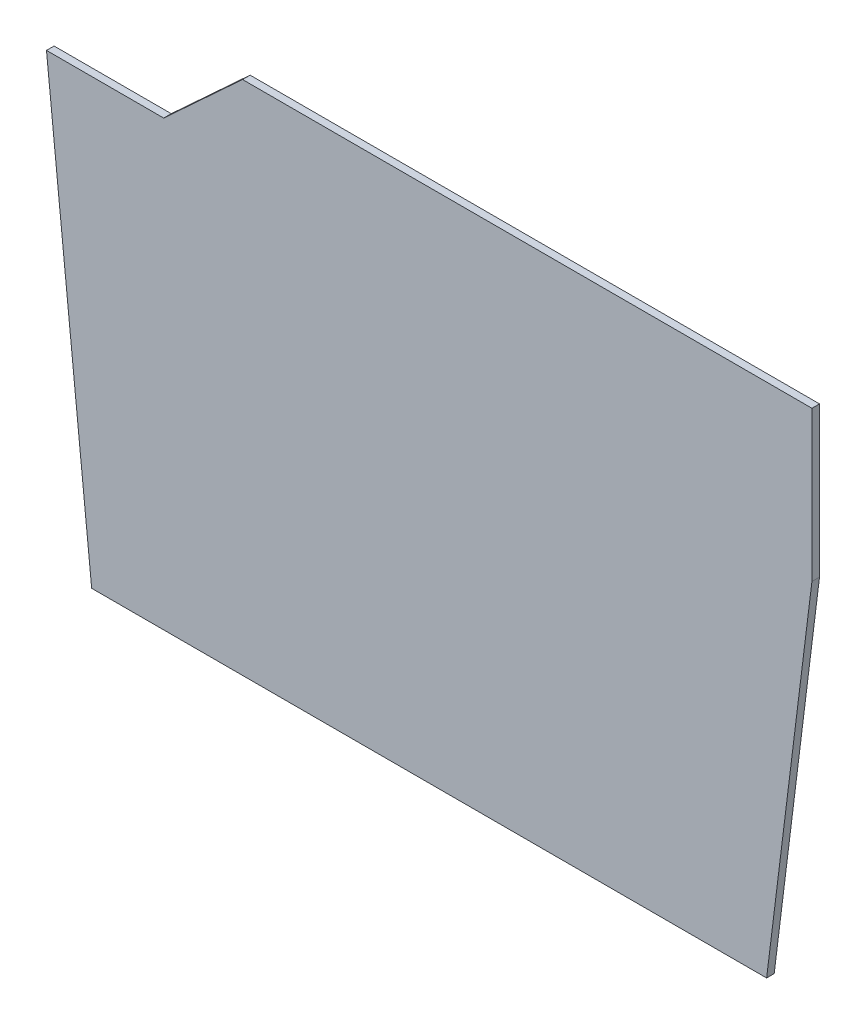
ISO-10303-21;
HEADER;
FILE_DESCRIPTION(('STEP AP214'),'2;1');
FILE_NAME('part.step','',(''),(''),'','','');
FILE_SCHEMA(('AUTOMOTIVE_DESIGN { 1 0 10303 214 1 1 1 1 }'));
ENDSEC;
DATA;
#1=APPLICATION_CONTEXT('core data for automotive mechanical design processes');
#2=APPLICATION_PROTOCOL_DEFINITION('international standard','automotive_design',2000,#1);
#3=PRODUCT_CONTEXT('',#1,'mechanical');
#4=PRODUCT('Part','Part','',(#3));
#5=PRODUCT_RELATED_PRODUCT_CATEGORY('part','',(#4));
#6=PRODUCT_DEFINITION_FORMATION('','',#4);
#7=PRODUCT_DEFINITION_CONTEXT('part definition',#1,'design');
#8=PRODUCT_DEFINITION('design','',#6,#7);
#9=PRODUCT_DEFINITION_SHAPE('','',#8);
#10=(LENGTH_UNIT() NAMED_UNIT(*) SI_UNIT(.MILLI.,.METRE.));
#11=(NAMED_UNIT(*) PLANE_ANGLE_UNIT() SI_UNIT($,.RADIAN.));
#12=(NAMED_UNIT(*) SI_UNIT($,.STERADIAN.) SOLID_ANGLE_UNIT());
#13=UNCERTAINTY_MEASURE_WITH_UNIT(LENGTH_MEASURE(1.E-05),#10,'distance_accuracy_value','');
#14=(GEOMETRIC_REPRESENTATION_CONTEXT(3) GLOBAL_UNCERTAINTY_ASSIGNED_CONTEXT((#13)) GLOBAL_UNIT_ASSIGNED_CONTEXT((#10,
#11,#12)) REPRESENTATION_CONTEXT('',''));
#15=CARTESIAN_POINT('',(0.,0.,0.));
#16=DIRECTION('',(0.,0.,1.));
#17=DIRECTION('',(1.,0.,0.));
#18=AXIS2_PLACEMENT_3D('',#15,#16,#17);
#19=CARTESIAN_POINT('',(0.107118927471592,-74.9999999999998,5.));
#20=DIRECTION('',(0.,-1.,0.));
#21=DIRECTION('',(0.,0.,-1.));
#22=AXIS2_PLACEMENT_3D('',#19,#20,#21);
#23=PLANE('',#22);
#24=DIRECTION('',(-1.,0.,0.));
#25=VECTOR('',#24,1.);
#26=CARTESIAN_POINT('',(0.107118927471592,-74.9999999999998,0.));
#27=LINE('',#26,#25);
#28=CARTESIAN_POINT('',(77.3909838344127,-74.9999999999998,0.));
#29=VERTEX_POINT('',#28);
#30=CARTESIAN_POINT('',(0.107118927471592,-74.9999999999998,0.));
#31=VERTEX_POINT('',#30);
#32=EDGE_CURVE('E133',#29,#31,#27,.T.);
#33=ORIENTED_EDGE('',*,*,#32,.T.);
#34=DIRECTION('',(0.,0.,-1.));
#35=VECTOR('',#34,1.);
#36=CARTESIAN_POINT('',(0.107118927471592,-74.9999999999998,5.));
#37=LINE('',#36,#35);
#38=CARTESIAN_POINT('',(0.107118927471592,-74.9999999999998,5.));
#39=VERTEX_POINT('',#38);
#40=EDGE_CURVE('E11',#39,#31,#37,.T.);
#41=ORIENTED_EDGE('',*,*,#40,.F.);
#42=DIRECTION('',(-1.,0.,0.));
#43=VECTOR('',#42,1.);
#44=CARTESIAN_POINT('',(0.107118927471592,-74.9999999999998,5.));
#45=LINE('',#44,#43);
#46=CARTESIAN_POINT('',(77.3909838344127,-74.9999999999998,5.));
#47=VERTEX_POINT('',#46);
#48=EDGE_CURVE('E150',#47,#39,#45,.T.);
#49=ORIENTED_EDGE('',*,*,#48,.F.);
#50=DIRECTION('',(0.,0.,-1.));
#51=VECTOR('',#50,1.);
#52=CARTESIAN_POINT('',(77.3909838344127,-74.9999999999998,5.));
#53=LINE('',#52,#51);
#54=EDGE_CURVE('E129',#47,#29,#53,.T.);
#55=ORIENTED_EDGE('',*,*,#54,.T.);
#56=EDGE_LOOP('',(#33,#41,#49,#55));
#57=FACE_BOUND('',#56,.T.);
#58=ADVANCED_FACE('F36',(#57),#23,.F.);
#59=CARTESIAN_POINT('',(0.107118927471592,-74.9999999999998,5.));
#60=DIRECTION('',(0.994844587720607,0.101411272958268,0.));
#61=DIRECTION('',(-0.101411272958268,0.994844587720607,0.));
#62=AXIS2_PLACEMENT_3D('',#59,#60,#61);
#63=PLANE('',#62);
#64=DIRECTION('',(0.101411272958268,-0.994844587720607,0.));
#65=VECTOR('',#64,1.);
#66=CARTESIAN_POINT('',(0.107118927471592,-74.9999999999998,0.));
#67=LINE('',#66,#65);
#68=CARTESIAN_POINT('',(29.9032453291026,-367.3,0.));
#69=VERTEX_POINT('',#68);
#70=EDGE_CURVE('E136',#31,#69,#67,.T.);
#71=ORIENTED_EDGE('',*,*,#70,.T.);
#72=DIRECTION('',(0.,0.,-1.));
#73=VECTOR('',#72,1.);
#74=CARTESIAN_POINT('',(29.9032453291026,-367.3,5.));
#75=LINE('',#74,#73);
#76=CARTESIAN_POINT('',(29.9032453291026,-367.3,5.));
#77=VERTEX_POINT('',#76);
#78=EDGE_CURVE('E45',#77,#69,#75,.T.);
#79=ORIENTED_EDGE('',*,*,#78,.F.);
#80=DIRECTION('',(0.101411272958268,-0.994844587720607,0.));
#81=VECTOR('',#80,1.);
#82=CARTESIAN_POINT('',(0.107118927471592,-74.9999999999998,5.));
#83=LINE('',#82,#81);
#84=EDGE_CURVE('E93',#39,#77,#83,.T.);
#85=ORIENTED_EDGE('',*,*,#84,.F.);
#86=ORIENTED_EDGE('',*,*,#40,.T.);
#87=EDGE_LOOP('',(#71,#79,#85,#86));
#88=FACE_BOUND('',#87,.T.);
#89=ADVANCED_FACE('F184',(#88),#63,.F.);
#90=CARTESIAN_POINT('',(29.9032453291026,-367.3,5.));
#91=DIRECTION('',(0.,1.,0.));
#92=DIRECTION('',(0.,0.,1.));
#93=AXIS2_PLACEMENT_3D('',#90,#91,#92);
#94=PLANE('',#93);
#95=DIRECTION('',(1.,0.,0.));
#96=VECTOR('',#95,1.);
#97=CARTESIAN_POINT('',(29.9032453291026,-367.3,0.));
#98=LINE('',#97,#96);
#99=CARTESIAN_POINT('',(474.959430720864,-367.3,0.));
#100=VERTEX_POINT('',#99);
#101=EDGE_CURVE('E139',#69,#100,#98,.T.);
#102=ORIENTED_EDGE('',*,*,#101,.T.);
#103=DIRECTION('',(0.,0.,-1.));
#104=VECTOR('',#103,1.);
#105=CARTESIAN_POINT('',(474.959430720864,-367.3,5.));
#106=LINE('',#105,#104);
#107=CARTESIAN_POINT('',(474.959430720864,-367.3,5.));
#108=VERTEX_POINT('',#107);
#109=EDGE_CURVE('E157',#108,#100,#106,.T.);
#110=ORIENTED_EDGE('',*,*,#109,.F.);
#111=DIRECTION('',(1.,0.,0.));
#112=VECTOR('',#111,1.);
#113=CARTESIAN_POINT('',(29.9032453291026,-367.3,5.));
#114=LINE('',#113,#112);
#115=EDGE_CURVE('E167',#77,#108,#114,.T.);
#116=ORIENTED_EDGE('',*,*,#115,.F.);
#117=ORIENTED_EDGE('',*,*,#78,.T.);
#118=EDGE_LOOP('',(#102,#110,#116,#117));
#119=FACE_BOUND('',#118,.T.);
#120=ADVANCED_FACE('F165',(#119),#94,.F.);
#121=CARTESIAN_POINT('',(474.959430720864,-367.3,5.));
#122=DIRECTION('',(-0.992422129071766,0.12287521201879,0.));
#123=DIRECTION('',(-0.12287521201879,-0.992422129071766,0.));
#124=AXIS2_PLACEMENT_3D('',#121,#122,#123);
#125=PLANE('',#124);
#126=DIRECTION('',(0.12287521201879,0.992422129071766,0.));
#127=VECTOR('',#126,1.);
#128=CARTESIAN_POINT('',(474.959430720864,-367.3,0.));
#129=LINE('',#128,#127);
#130=CARTESIAN_POINT('',(504.843253,-125.938328725511,0.));
#131=VERTEX_POINT('',#130);
#132=EDGE_CURVE('E141',#100,#131,#129,.T.);
#133=ORIENTED_EDGE('',*,*,#132,.T.);
#134=DIRECTION('',(0.,0.,-1.));
#135=VECTOR('',#134,1.);
#136=CARTESIAN_POINT('',(504.843253,-125.938328725511,5.));
#137=LINE('',#136,#135);
#138=CARTESIAN_POINT('',(504.843253,-125.938328725511,5.));
#139=VERTEX_POINT('',#138);
#140=EDGE_CURVE('E120',#139,#131,#137,.T.);
#141=ORIENTED_EDGE('',*,*,#140,.F.);
#142=DIRECTION('',(0.12287521201879,0.992422129071766,0.));
#143=VECTOR('',#142,1.);
#144=CARTESIAN_POINT('',(474.959430720864,-367.3,5.));
#145=LINE('',#144,#143);
#146=EDGE_CURVE('E109',#108,#139,#145,.T.);
#147=ORIENTED_EDGE('',*,*,#146,.F.);
#148=ORIENTED_EDGE('',*,*,#109,.T.);
#149=EDGE_LOOP('',(#133,#141,#147,#148));
#150=FACE_BOUND('',#149,.T.);
#151=ADVANCED_FACE('F173',(#150),#125,.F.);
#152=CARTESIAN_POINT('',(504.843253,-125.938328725511,5.));
#153=DIRECTION('',(-1.,0.,0.));
#154=DIRECTION('',(0.,-1.,0.));
#155=AXIS2_PLACEMENT_3D('',#152,#153,#154);
#156=PLANE('',#155);
#157=DIRECTION('',(0.,1.,0.));
#158=VECTOR('',#157,1.);
#159=CARTESIAN_POINT('',(504.843253,-125.938328725511,0.));
#160=LINE('',#159,#158);
#161=CARTESIAN_POINT('',(504.843252999999,-26.9999999999999,0.));
#162=VERTEX_POINT('',#161);
#163=EDGE_CURVE('E118',#131,#162,#160,.T.);
#164=ORIENTED_EDGE('',*,*,#163,.T.);
#165=DIRECTION('',(0.,0.,-1.));
#166=VECTOR('',#165,1.);
#167=CARTESIAN_POINT('',(504.843252999999,-26.9999999999999,5.));
#168=LINE('',#167,#166);
#169=CARTESIAN_POINT('',(504.843252999999,-26.9999999999999,5.));
#170=VERTEX_POINT('',#169);
#171=EDGE_CURVE('E115',#170,#162,#168,.T.);
#172=ORIENTED_EDGE('',*,*,#171,.F.);
#173=DIRECTION('',(0.,1.,0.));
#174=VECTOR('',#173,1.);
#175=CARTESIAN_POINT('',(504.843253,-125.938328725511,5.));
#176=LINE('',#175,#174);
#177=EDGE_CURVE('E103',#139,#170,#176,.T.);
#178=ORIENTED_EDGE('',*,*,#177,.F.);
#179=ORIENTED_EDGE('',*,*,#140,.T.);
#180=EDGE_LOOP('',(#164,#172,#178,#179));
#181=FACE_BOUND('',#180,.T.);
#182=ADVANCED_FACE('F116',(#181),#156,.F.);
#183=CARTESIAN_POINT('',(504.843252999999,-26.9999999999999,5.));
#184=DIRECTION('',(0.,-1.,0.));
#185=DIRECTION('',(0.,0.,-1.));
#186=AXIS2_PLACEMENT_3D('',#183,#184,#185);
#187=PLANE('',#186);
#188=DIRECTION('',(-1.,0.,0.));
#189=VECTOR('',#188,1.);
#190=CARTESIAN_POINT('',(504.843252999999,-26.9999999999999,0.));
#191=LINE('',#190,#189);
#192=CARTESIAN_POINT('',(129.390983834413,-26.9999999999999,0.));
#193=VERTEX_POINT('',#192);
#194=EDGE_CURVE('E79',#162,#193,#191,.T.);
#195=ORIENTED_EDGE('',*,*,#194,.T.);
#196=DIRECTION('',(0.,0.,-1.));
#197=VECTOR('',#196,1.);
#198=CARTESIAN_POINT('',(129.390983834413,-26.9999999999999,5.));
#199=LINE('',#198,#197);
#200=CARTESIAN_POINT('',(129.390983834413,-26.9999999999999,5.));
#201=VERTEX_POINT('',#200);
#202=EDGE_CURVE('E121',#201,#193,#199,.T.);
#203=ORIENTED_EDGE('',*,*,#202,.F.);
#204=DIRECTION('',(-1.,0.,0.));
#205=VECTOR('',#204,1.);
#206=CARTESIAN_POINT('',(504.843252999999,-26.9999999999999,5.));
#207=LINE('',#206,#205);
#208=EDGE_CURVE('E107',#170,#201,#207,.T.);
#209=ORIENTED_EDGE('',*,*,#208,.F.);
#210=ORIENTED_EDGE('',*,*,#171,.T.);
#211=EDGE_LOOP('',(#195,#203,#209,#210));
#212=FACE_BOUND('',#211,.T.);
#213=ADVANCED_FACE('F123',(#212),#187,.F.);
#214=CARTESIAN_POINT('',(77.3909838344127,-74.9999999999998,5.));
#215=DIRECTION('',(0.678280102733065,-0.734803444627488,0.));
#216=DIRECTION('',(0.734803444627488,0.678280102733065,0.));
#217=AXIS2_PLACEMENT_3D('',#214,#215,#216);
#218=PLANE('',#217);
#219=DIRECTION('',(-0.734803444627488,-0.678280102733065,0.));
#220=VECTOR('',#219,1.);
#221=CARTESIAN_POINT('',(77.3909838344127,-74.9999999999998,0.));
#222=LINE('',#221,#220);
#223=EDGE_CURVE('E85',#193,#29,#222,.T.);
#224=ORIENTED_EDGE('',*,*,#223,.T.);
#225=ORIENTED_EDGE('',*,*,#54,.F.);
#226=DIRECTION('',(-0.734803444627488,-0.678280102733065,0.));
#227=VECTOR('',#226,1.);
#228=CARTESIAN_POINT('',(77.3909838344127,-74.9999999999998,5.));
#229=LINE('',#228,#227);
#230=EDGE_CURVE('E53',#201,#47,#229,.T.);
#231=ORIENTED_EDGE('',*,*,#230,.F.);
#232=ORIENTED_EDGE('',*,*,#202,.T.);
#233=EDGE_LOOP('',(#224,#225,#231,#232));
#234=FACE_BOUND('',#233,.T.);
#235=ADVANCED_FACE('F198',(#234),#218,.F.);
#236=CARTESIAN_POINT('',(0.,0.,5.));
#237=DIRECTION('',(0.,0.,1.));
#238=DIRECTION('',(1.,0.,0.));
#239=AXIS2_PLACEMENT_3D('',#236,#237,#238);
#240=PLANE('',#239);
#241=ORIENTED_EDGE('',*,*,#48,.T.);
#242=ORIENTED_EDGE('',*,*,#84,.T.);
#243=ORIENTED_EDGE('',*,*,#115,.T.);
#244=ORIENTED_EDGE('',*,*,#146,.T.);
#245=ORIENTED_EDGE('',*,*,#177,.T.);
#246=ORIENTED_EDGE('',*,*,#208,.T.);
#247=ORIENTED_EDGE('',*,*,#230,.T.);
#248=EDGE_LOOP('',(#241,#242,#243,#244,#245,#246,#247));
#249=FACE_BOUND('',#248,.T.);
#250=ADVANCED_FACE('F105',(#249),#240,.T.);
#251=CARTESIAN_POINT('',(0.,0.,0.));
#252=DIRECTION('',(0.,0.,1.));
#253=DIRECTION('',(1.,0.,0.));
#254=AXIS2_PLACEMENT_3D('',#251,#252,#253);
#255=PLANE('',#254);
#256=ORIENTED_EDGE('',*,*,#32,.F.);
#257=ORIENTED_EDGE('',*,*,#223,.F.);
#258=ORIENTED_EDGE('',*,*,#194,.F.);
#259=ORIENTED_EDGE('',*,*,#163,.F.);
#260=ORIENTED_EDGE('',*,*,#132,.F.);
#261=ORIENTED_EDGE('',*,*,#101,.F.);
#262=ORIENTED_EDGE('',*,*,#70,.F.);
#263=EDGE_LOOP('',(#256,#257,#258,#259,#260,#261,#262));
#264=FACE_BOUND('',#263,.T.);
#265=ADVANCED_FACE('F171',(#264),#255,.F.);
#266=CLOSED_SHELL('',(#58,#89,#120,#151,#182,#213,#235,#250,#265));
#267=MANIFOLD_SOLID_BREP('B2',#266);
#268=ADVANCED_BREP_SHAPE_REPRESENTATION('',(#18,#267),#14);
#269=SHAPE_DEFINITION_REPRESENTATION(#9,#268);
ENDSEC;
END-ISO-10303-21;
